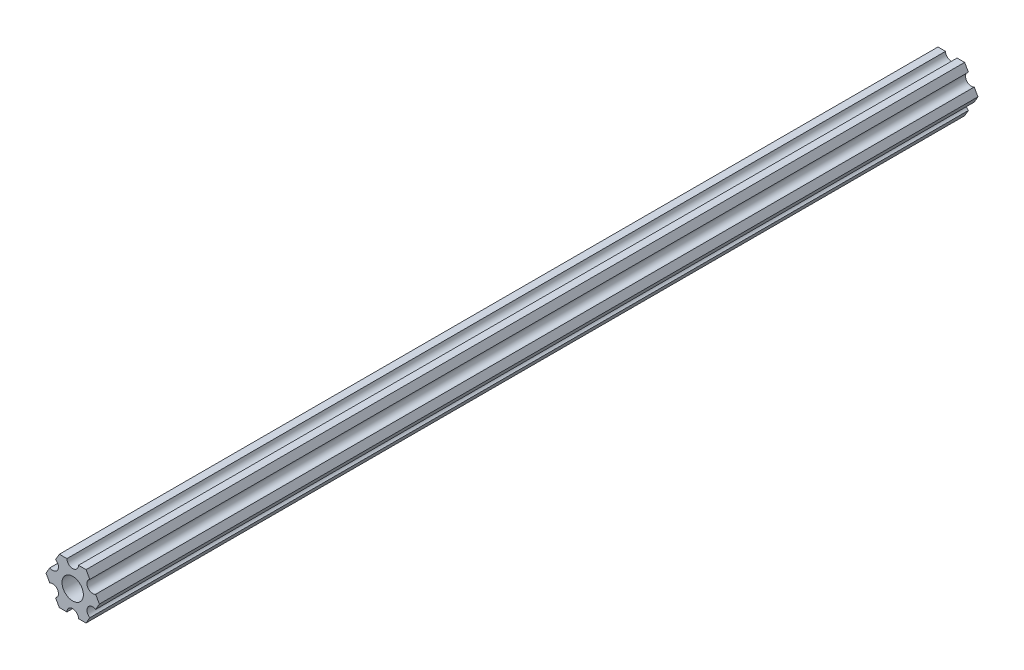
ISO-10303-21;
HEADER;
FILE_DESCRIPTION(('STEP AP214'),'2;1');
FILE_NAME('part.step','',(''),(''),'','','');
FILE_SCHEMA(('AUTOMOTIVE_DESIGN { 1 0 10303 214 1 1 1 1 }'));
ENDSEC;
DATA;
#1=APPLICATION_CONTEXT('core data for automotive mechanical design processes');
#2=APPLICATION_PROTOCOL_DEFINITION('international standard','automotive_design',2000,#1);
#3=PRODUCT_CONTEXT('',#1,'mechanical');
#4=PRODUCT('Part','Part','',(#3));
#5=PRODUCT_RELATED_PRODUCT_CATEGORY('part','',(#4));
#6=PRODUCT_DEFINITION_FORMATION('','',#4);
#7=PRODUCT_DEFINITION_CONTEXT('part definition',#1,'design');
#8=PRODUCT_DEFINITION('design','',#6,#7);
#9=PRODUCT_DEFINITION_SHAPE('','',#8);
#10=(LENGTH_UNIT() NAMED_UNIT(*) SI_UNIT(.MILLI.,.METRE.));
#11=(NAMED_UNIT(*) PLANE_ANGLE_UNIT() SI_UNIT($,.RADIAN.));
#12=(NAMED_UNIT(*) SI_UNIT($,.STERADIAN.) SOLID_ANGLE_UNIT());
#13=UNCERTAINTY_MEASURE_WITH_UNIT(LENGTH_MEASURE(1.E-05),#10,'distance_accuracy_value','');
#14=(GEOMETRIC_REPRESENTATION_CONTEXT(3) GLOBAL_UNCERTAINTY_ASSIGNED_CONTEXT((#13)) GLOBAL_UNIT_ASSIGNED_CONTEXT((#10,
#11,#12)) REPRESENTATION_CONTEXT('',''));
#15=CARTESIAN_POINT('',(0.,0.,0.));
#16=DIRECTION('',(0.,0.,1.));
#17=DIRECTION('',(1.,0.,0.));
#18=AXIS2_PLACEMENT_3D('',#15,#16,#17);
#19=CARTESIAN_POINT('',(6.29301142309098,-1.80018429024546,85.725));
#20=DIRECTION('',(-0.866025434075723,0.499999947533953,0.));
#21=DIRECTION('',(0.,0.,1.));
#22=AXIS2_PLACEMENT_3D('',#19,#20,#21);
#23=PLANE('',#22);
#24=DIRECTION('',(0.,0.,1.));
#25=VECTOR('',#24,1.);
#26=CARTESIAN_POINT('',(7.33234841870827,4.44212519169686E-07,85.725));
#27=LINE('',#26,#25);
#28=CARTESIAN_POINT('',(7.33234841870826,4.44212518961143E-07,-155.575));
#29=VERTEX_POINT('',#28);
#30=CARTESIAN_POINT('',(7.33234841870826,4.44212519315656E-07,85.725));
#31=VERTEX_POINT('',#30);
#32=EDGE_CURVE('E12',#29,#31,#27,.T.);
#33=ORIENTED_EDGE('',*,*,#32,.T.);
#34=DIRECTION('',(0.499999947533953,0.866025434075723,0.));
#35=VECTOR('',#34,1.);
#36=CARTESIAN_POINT('',(6.29301142309098,-1.80018429024546,85.725));
#37=LINE('',#36,#35);
#38=CARTESIAN_POINT('',(6.29301142309098,-1.80018429024546,85.725));
#39=VERTEX_POINT('',#38);
#40=EDGE_CURVE('E303',#39,#31,#37,.T.);
#41=ORIENTED_EDGE('',*,*,#40,.F.);
#42=DIRECTION('',(0.,0.,-1.));
#43=VECTOR('',#42,1.);
#44=CARTESIAN_POINT('',(6.29301142309098,-1.80018429024546,85.725));
#45=LINE('',#44,#43);
#46=CARTESIAN_POINT('',(6.29301142309098,-1.80018429024546,-155.575));
#47=VERTEX_POINT('',#46);
#48=EDGE_CURVE('E302',#39,#47,#45,.T.);
#49=ORIENTED_EDGE('',*,*,#48,.T.);
#50=DIRECTION('',(-0.499999947533953,-0.866025434075723,0.));
#51=VECTOR('',#50,1.);
#52=CARTESIAN_POINT('',(6.29301142309098,-1.80018429024546,-155.575));
#53=LINE('',#52,#51);
#54=EDGE_CURVE('E221',#29,#47,#53,.T.);
#55=ORIENTED_EDGE('',*,*,#54,.F.);
#56=EDGE_LOOP('',(#33,#41,#49,#55));
#57=FACE_BOUND('',#56,.T.);
#58=ADVANCED_FACE('F53',(#57),#23,.F.);
#59=CARTESIAN_POINT('',(7.33234841870827,4.44212519169686E-07,85.725));
#60=DIRECTION('',(-0.866025373493145,-0.500000052466057,0.));
#61=DIRECTION('',(-0.500000052466057,0.866025373493145,0.));
#62=AXIS2_PLACEMENT_3D('',#59,#60,#61);
#63=PLANE('',#62);
#64=DIRECTION('',(0.,0.,1.));
#65=VECTOR('',#64,1.);
#66=CARTESIAN_POINT('',(6.29301120497139,1.80018505273894,85.725));
#67=LINE('',#66,#65);
#68=CARTESIAN_POINT('',(6.29301120497139,1.80018505273894,-155.575));
#69=VERTEX_POINT('',#68);
#70=CARTESIAN_POINT('',(6.29301120497139,1.80018505273894,85.725));
#71=VERTEX_POINT('',#70);
#72=EDGE_CURVE('E61',#69,#71,#67,.T.);
#73=ORIENTED_EDGE('',*,*,#72,.T.);
#74=DIRECTION('',(-0.500000052466057,0.866025373493145,0.));
#75=VECTOR('',#74,1.);
#76=CARTESIAN_POINT('',(7.33234841870827,4.44212519198906E-07,85.725));
#77=LINE('',#76,#75);
#78=EDGE_CURVE('E307',#31,#71,#77,.T.);
#79=ORIENTED_EDGE('',*,*,#78,.F.);
#80=ORIENTED_EDGE('',*,*,#32,.F.);
#81=DIRECTION('',(0.500000052466055,-0.866025373493145,0.));
#82=VECTOR('',#81,1.);
#83=CARTESIAN_POINT('',(7.33234841870826,4.44212518961143E-07,-155.575));
#84=LINE('',#83,#82);
#85=EDGE_CURVE('E215',#69,#29,#84,.T.);
#86=ORIENTED_EDGE('',*,*,#85,.F.);
#87=EDGE_LOOP('',(#73,#79,#80,#86));
#88=FACE_BOUND('',#87,.T.);
#89=ADVANCED_FACE('F216',(#88),#63,.F.);
#90=CARTESIAN_POINT('',(4.70551103839172,4.54981561357972,85.725));
#91=DIRECTION('',(-0.866025373493151,-0.500000052466046,0.));
#92=DIRECTION('',(-0.500000052466046,0.866025373493151,0.));
#93=AXIS2_PLACEMENT_3D('',#90,#91,#92);
#94=PLANE('',#93);
#95=DIRECTION('',(0.,0.,1.));
#96=VECTOR('',#95,1.);
#97=CARTESIAN_POINT('',(3.66617382465481,6.35000022210627,85.725));
#98=LINE('',#97,#96);
#99=CARTESIAN_POINT('',(3.66617382465481,6.35000022210627,-155.575));
#100=VERTEX_POINT('',#99);
#101=CARTESIAN_POINT('',(3.66617382465481,6.35000022210627,85.725));
#102=VERTEX_POINT('',#101);
#103=EDGE_CURVE('E213',#100,#102,#98,.T.);
#104=ORIENTED_EDGE('',*,*,#103,.T.);
#105=DIRECTION('',(-0.500000052466046,0.866025373493151,0.));
#106=VECTOR('',#105,1.);
#107=CARTESIAN_POINT('',(4.70551103839172,4.54981561357972,85.725));
#108=LINE('',#107,#106);
#109=CARTESIAN_POINT('',(4.70551103839172,4.54981561357972,85.725));
#110=VERTEX_POINT('',#109);
#111=EDGE_CURVE('E338',#110,#102,#108,.T.);
#112=ORIENTED_EDGE('',*,*,#111,.F.);
#113=DIRECTION('',(0.,0.,1.));
#114=VECTOR('',#113,1.);
#115=CARTESIAN_POINT('',(4.70551103839172,4.54981561357972,85.725));
#116=LINE('',#115,#114);
#117=CARTESIAN_POINT('',(4.70551103839172,4.54981561357972,-155.575));
#118=VERTEX_POINT('',#117);
#119=EDGE_CURVE('E301',#118,#110,#116,.T.);
#120=ORIENTED_EDGE('',*,*,#119,.F.);
#121=DIRECTION('',(0.500000052466045,-0.866025373493151,0.));
#122=VECTOR('',#121,1.);
#123=CARTESIAN_POINT('',(4.70551103839172,4.54981561357972,-155.575));
#124=LINE('',#123,#122);
#125=EDGE_CURVE('E227',#100,#118,#124,.T.);
#126=ORIENTED_EDGE('',*,*,#125,.F.);
#127=EDGE_LOOP('',(#104,#112,#120,#126));
#128=FACE_BOUND('',#127,.T.);
#129=ADVANCED_FACE('F414',(#128),#94,.F.);
#130=CARTESIAN_POINT('',(3.66617382465481,6.35000022210627,85.725));
#131=DIRECTION('',(6.05825850611185E-08,-1.,0.));
#132=DIRECTION('',(0.,0.,-1.));
#133=AXIS2_PLACEMENT_3D('',#130,#131,#132);
#134=PLANE('',#133);
#135=DIRECTION('',(0.,0.,1.));
#136=VECTOR('',#135,1.);
#137=CARTESIAN_POINT('',(1.58749961530074,6.35000009617482,85.725));
#138=LINE('',#137,#136);
#139=CARTESIAN_POINT('',(1.58749961530073,6.35000015914054,-155.575));
#140=VERTEX_POINT('',#139);
#141=CARTESIAN_POINT('',(1.58749961530073,6.35000015914054,85.725));
#142=VERTEX_POINT('',#141);
#143=EDGE_CURVE('E335',#140,#142,#138,.T.);
#144=ORIENTED_EDGE('',*,*,#143,.T.);
#145=DIRECTION('',(-1.,0.,0.));
#146=VECTOR('',#145,1.);
#147=CARTESIAN_POINT('',(5.49926112168156,6.35000022210627,85.725));
#148=LINE('',#147,#146);
#149=EDGE_CURVE('E342',#102,#142,#148,.T.);
#150=ORIENTED_EDGE('',*,*,#149,.F.);
#151=ORIENTED_EDGE('',*,*,#103,.F.);
#152=DIRECTION('',(1.,3.02912931564594E-08,0.));
#153=VECTOR('',#152,1.);
#154=CARTESIAN_POINT('',(3.66617382465481,6.35000022210627,-155.575));
#155=LINE('',#154,#153);
#156=EDGE_CURVE('E289',#140,#100,#155,.T.);
#157=ORIENTED_EDGE('',*,*,#156,.F.);
#158=EDGE_LOOP('',(#144,#150,#151,#157));
#159=FACE_BOUND('',#158,.T.);
#160=ADVANCED_FACE('F417',(#159),#134,.F.);
#161=CARTESIAN_POINT('',(-3.84699260060323E-07,6.35,85.725));
#162=DIRECTION('',(0.,0.,-1.));
#163=DIRECTION('',(-1.,0.,0.));
#164=AXIS2_PLACEMENT_3D('',#161,#162,#163);
#165=CYLINDRICAL_SURFACE('',#164,1.5875);
#166=DIRECTION('',(0.,0.,1.));
#167=VECTOR('',#166,1.);
#168=CARTESIAN_POINT('',(-1.58750038469926,6.34999990382518,85.725));
#169=LINE('',#168,#167);
#170=CARTESIAN_POINT('',(-1.58750038469926,6.34999990382519,-155.575));
#171=VERTEX_POINT('',#170);
#172=CARTESIAN_POINT('',(-1.58750038469926,6.34999990382519,85.725));
#173=VERTEX_POINT('',#172);
#174=EDGE_CURVE('E332',#171,#173,#169,.T.);
#175=ORIENTED_EDGE('',*,*,#174,.T.);
#176=CARTESIAN_POINT('',(-3.84699260060323E-07,6.35,85.725));
#177=DIRECTION('',(0.,0.,-1.));
#178=DIRECTION('',(-1.,0.,0.));
#179=AXIS2_PLACEMENT_3D('',#176,#177,#178);
#180=CIRCLE('',#179,1.5875);
#181=EDGE_CURVE('E346',#142,#173,#180,.T.);
#182=ORIENTED_EDGE('',*,*,#181,.F.);
#183=ORIENTED_EDGE('',*,*,#143,.F.);
#184=CARTESIAN_POINT('',(-3.84699260060323E-07,6.35,-155.575));
#185=DIRECTION('',(0.,0.,1.));
#186=DIRECTION('',(-1.,0.,0.));
#187=AXIS2_PLACEMENT_3D('',#184,#185,#186);
#188=CIRCLE('',#187,1.5875);
#189=EDGE_CURVE('E285',#171,#140,#188,.T.);
#190=ORIENTED_EDGE('',*,*,#189,.F.);
#191=EDGE_LOOP('',(#175,#182,#183,#190));
#192=FACE_BOUND('',#191,.T.);
#193=ADVANCED_FACE('F466',(#192),#165,.F.);
#194=CARTESIAN_POINT('',(-1.58750038469926,6.34999990382518,85.725));
#195=DIRECTION('',(6.05825963273174E-08,-1.,0.));
#196=DIRECTION('',(0.,0.,-1.));
#197=AXIS2_PLACEMENT_3D('',#194,#195,#196);
#198=PLANE('',#197);
#199=DIRECTION('',(0.,0.,1.));
#200=VECTOR('',#199,1.);
#201=CARTESIAN_POINT('',(-3.66617459405349,6.3499997778937,85.725));
#202=LINE('',#201,#200);
#203=CARTESIAN_POINT('',(-3.66617454558244,6.34999986184803,-155.575));
#204=VERTEX_POINT('',#203);
#205=CARTESIAN_POINT('',(-3.66617454558244,6.34999986184803,85.725));
#206=VERTEX_POINT('',#205);
#207=EDGE_CURVE('E325',#204,#206,#202,.T.);
#208=ORIENTED_EDGE('',*,*,#207,.T.);
#209=DIRECTION('',(-1.,0.,0.));
#210=VECTOR('',#209,1.);
#211=CARTESIAN_POINT('',(5.49926112168156,6.34999990382519,85.725));
#212=LINE('',#211,#210);
#213=EDGE_CURVE('E350',#173,#206,#212,.T.);
#214=ORIENTED_EDGE('',*,*,#213,.F.);
#215=ORIENTED_EDGE('',*,*,#174,.F.);
#216=DIRECTION('',(1.,2.0194198968488E-08,0.));
#217=VECTOR('',#216,1.);
#218=CARTESIAN_POINT('',(-1.58750038469926,6.34999990382519,-155.575));
#219=LINE('',#218,#217);
#220=EDGE_CURVE('E281',#204,#171,#219,.T.);
#221=ORIENTED_EDGE('',*,*,#220,.F.);
#222=EDGE_LOOP('',(#208,#214,#215,#221));
#223=FACE_BOUND('',#222,.T.);
#224=ADVANCED_FACE('F463',(#223),#198,.F.);
#225=CARTESIAN_POINT('',(-3.66617459405349,6.3499997778937,85.725));
#226=DIRECTION('',(0.866025434075729,-0.499999947533942,0.));
#227=DIRECTION('',(0.,0.,-1.));
#228=AXIS2_PLACEMENT_3D('',#225,#226,#227);
#229=PLANE('',#228);
#230=DIRECTION('',(0.,0.,1.));
#231=VECTOR('',#230,1.);
#232=CARTESIAN_POINT('',(-4.70551158967065,4.54981504343587,85.725));
#233=LINE('',#232,#231);
#234=CARTESIAN_POINT('',(-4.70551158967065,4.54981504343587,-155.575));
#235=VERTEX_POINT('',#234);
#236=CARTESIAN_POINT('',(-4.70551158967065,4.54981504343587,85.725));
#237=VERTEX_POINT('',#236);
#238=EDGE_CURVE('E322',#235,#237,#233,.T.);
#239=ORIENTED_EDGE('',*,*,#238,.T.);
#240=DIRECTION('',(-0.499999947533943,-0.866025434075729,0.));
#241=VECTOR('',#240,1.);
#242=CARTESIAN_POINT('',(-3.66617459405349,6.3499997778937,85.725));
#243=LINE('',#242,#241);
#244=EDGE_CURVE('E354',#206,#237,#243,.T.);
#245=ORIENTED_EDGE('',*,*,#244,.F.);
#246=ORIENTED_EDGE('',*,*,#207,.F.);
#247=DIRECTION('',(0.499999947533939,0.866025434075731,0.));
#248=VECTOR('',#247,1.);
#249=CARTESIAN_POINT('',(-3.66617454558244,6.34999986184803,-155.575));
#250=LINE('',#249,#248);
#251=EDGE_CURVE('E277',#235,#204,#250,.T.);
#252=ORIENTED_EDGE('',*,*,#251,.F.);
#253=EDGE_LOOP('',(#239,#245,#246,#252));
#254=FACE_BOUND('',#253,.T.);
#255=ADVANCED_FACE('F459',(#254),#229,.F.);
#256=CARTESIAN_POINT('',(-5.49926150638082,3.17499966684067,85.725));
#257=DIRECTION('',(0.,0.,-1.));
#258=DIRECTION('',(-1.,0.,0.));
#259=AXIS2_PLACEMENT_3D('',#256,#257,#258);
#260=CYLINDRICAL_SURFACE('',#259,1.5875);
#261=DIRECTION('',(0.,0.,1.));
#262=VECTOR('',#261,1.);
#263=CARTESIAN_POINT('',(-6.29301142309098,1.80018429024547,85.725));
#264=LINE('',#263,#262);
#265=CARTESIAN_POINT('',(-6.29301142309098,1.80018429024546,-155.575));
#266=VERTEX_POINT('',#265);
#267=CARTESIAN_POINT('',(-6.29301142309098,1.80018429024547,85.725));
#268=VERTEX_POINT('',#267);
#269=EDGE_CURVE('E326',#266,#268,#264,.T.);
#270=ORIENTED_EDGE('',*,*,#269,.T.);
#271=CARTESIAN_POINT('',(-5.49926150638082,3.17499966684067,85.725));
#272=DIRECTION('',(0.,0.,-1.));
#273=DIRECTION('',(-1.,0.,0.));
#274=AXIS2_PLACEMENT_3D('',#271,#272,#273);
#275=CIRCLE('',#274,1.5875);
#276=EDGE_CURVE('E364',#237,#268,#275,.T.);
#277=ORIENTED_EDGE('',*,*,#276,.F.);
#278=ORIENTED_EDGE('',*,*,#238,.F.);
#279=CARTESIAN_POINT('',(-5.49926150638082,3.17499966684067,-155.575));
#280=DIRECTION('',(0.,0.,1.));
#281=DIRECTION('',(-1.,0.,0.));
#282=AXIS2_PLACEMENT_3D('',#279,#280,#281);
#283=CIRCLE('',#282,1.5875);
#284=EDGE_CURVE('E273',#266,#235,#283,.T.);
#285=ORIENTED_EDGE('',*,*,#284,.F.);
#286=EDGE_LOOP('',(#270,#277,#278,#285));
#287=FACE_BOUND('',#286,.T.);
#288=ADVANCED_FACE('F455',(#287),#260,.F.);
#289=CARTESIAN_POINT('',(-6.29301142309098,1.80018429024547,85.725));
#290=DIRECTION('',(0.866025434075724,-0.499999947533952,0.));
#291=DIRECTION('',(0.,0.,-1.));
#292=AXIS2_PLACEMENT_3D('',#289,#290,#291);
#293=PLANE('',#292);
#294=DIRECTION('',(0.,0.,1.));
#295=VECTOR('',#294,1.);
#296=CARTESIAN_POINT('',(-7.33234841870827,-4.44212523790841E-07,85.725));
#297=LINE('',#296,#295);
#298=CARTESIAN_POINT('',(-7.33234841870826,-4.44212524036367E-07,-155.575));
#299=VERTEX_POINT('',#298);
#300=CARTESIAN_POINT('',(-7.33234841870826,-4.44212524036367E-07,85.725));
#301=VERTEX_POINT('',#300);
#302=EDGE_CURVE('E319',#299,#301,#297,.T.);
#303=ORIENTED_EDGE('',*,*,#302,.T.);
#304=DIRECTION('',(-0.499999947533952,-0.866025434075724,0.));
#305=VECTOR('',#304,1.);
#306=CARTESIAN_POINT('',(-6.29301142309098,1.80018429024547,85.725));
#307=LINE('',#306,#305);
#308=EDGE_CURVE('E360',#268,#301,#307,.T.);
#309=ORIENTED_EDGE('',*,*,#308,.F.);
#310=ORIENTED_EDGE('',*,*,#269,.F.);
#311=DIRECTION('',(0.499999947533951,0.866025434075724,0.));
#312=VECTOR('',#311,1.);
#313=CARTESIAN_POINT('',(-6.29301142309098,1.80018429024547,-155.575));
#314=LINE('',#313,#312);
#315=EDGE_CURVE('E269',#299,#266,#314,.T.);
#316=ORIENTED_EDGE('',*,*,#315,.F.);
#317=EDGE_LOOP('',(#303,#309,#310,#316));
#318=FACE_BOUND('',#317,.T.);
#319=ADVANCED_FACE('F451',(#318),#293,.F.);
#320=CARTESIAN_POINT('',(-7.33234841870827,-4.44212523790841E-07,85.725));
#321=DIRECTION('',(0.866025373493151,0.500000052466045,0.));
#322=DIRECTION('',(0.,0.,-1.));
#323=AXIS2_PLACEMENT_3D('',#320,#321,#322);
#324=PLANE('',#323);
#325=DIRECTION('',(0.,0.,1.));
#326=VECTOR('',#325,1.);
#327=CARTESIAN_POINT('',(-6.29301120497141,-1.80018505273897,85.725));
#328=LINE('',#327,#326);
#329=CARTESIAN_POINT('',(-6.29301120497141,-1.80018505273897,-155.575));
#330=VERTEX_POINT('',#329);
#331=CARTESIAN_POINT('',(-6.29301120497141,-1.80018505273897,85.725));
#332=VERTEX_POINT('',#331);
#333=EDGE_CURVE('E312',#330,#332,#328,.T.);
#334=ORIENTED_EDGE('',*,*,#333,.T.);
#335=DIRECTION('',(0.500000052466045,-0.866025373493151,0.));
#336=VECTOR('',#335,1.);
#337=CARTESIAN_POINT('',(-7.33234841870827,-4.44212523969395E-07,85.725));
#338=LINE('',#337,#336);
#339=EDGE_CURVE('E355',#301,#332,#338,.T.);
#340=ORIENTED_EDGE('',*,*,#339,.F.);
#341=ORIENTED_EDGE('',*,*,#302,.F.);
#342=DIRECTION('',(-0.500000052466045,0.866025373493152,0.));
#343=VECTOR('',#342,1.);
#344=CARTESIAN_POINT('',(-7.33234841870826,-4.44212524036367E-07,-155.575));
#345=LINE('',#344,#343);
#346=EDGE_CURVE('E265',#330,#299,#345,.T.);
#347=ORIENTED_EDGE('',*,*,#346,.F.);
#348=EDGE_LOOP('',(#334,#340,#341,#347));
#349=FACE_BOUND('',#348,.T.);
#350=ADVANCED_FACE('F447',(#349),#324,.F.);
#351=CARTESIAN_POINT('',(-5.49926112168156,-3.17500033315934,85.725));
#352=DIRECTION('',(0.,0.,-1.));
#353=DIRECTION('',(-1.,0.,0.));
#354=AXIS2_PLACEMENT_3D('',#351,#352,#353);
#355=CYLINDRICAL_SURFACE('',#354,1.5875);
#356=DIRECTION('',(0.,0.,1.));
#357=VECTOR('',#356,1.);
#358=CARTESIAN_POINT('',(-4.70551103839172,-4.54981561357972,85.725));
#359=LINE('',#358,#357);
#360=CARTESIAN_POINT('',(-4.70551103839172,-4.54981561357972,-155.575));
#361=VERTEX_POINT('',#360);
#362=CARTESIAN_POINT('',(-4.70551103839172,-4.54981561357972,85.725));
#363=VERTEX_POINT('',#362);
#364=EDGE_CURVE('E309',#361,#363,#359,.T.);
#365=ORIENTED_EDGE('',*,*,#364,.T.);
#366=CARTESIAN_POINT('',(-5.49926112168156,-3.17500033315934,85.725));
#367=DIRECTION('',(0.,0.,-1.));
#368=DIRECTION('',(-1.,0.,0.));
#369=AXIS2_PLACEMENT_3D('',#366,#367,#368);
#370=CIRCLE('',#369,1.5875);
#371=EDGE_CURVE('E359',#332,#363,#370,.T.);
#372=ORIENTED_EDGE('',*,*,#371,.F.);
#373=ORIENTED_EDGE('',*,*,#333,.F.);
#374=CARTESIAN_POINT('',(-5.49926112168156,-3.17500033315934,-155.575));
#375=DIRECTION('',(0.,0.,1.));
#376=DIRECTION('',(-1.,0.,0.));
#377=AXIS2_PLACEMENT_3D('',#374,#375,#376);
#378=CIRCLE('',#377,1.5875);
#379=EDGE_CURVE('E261',#361,#330,#378,.T.);
#380=ORIENTED_EDGE('',*,*,#379,.F.);
#381=EDGE_LOOP('',(#365,#372,#373,#380));
#382=FACE_BOUND('',#381,.T.);
#383=ADVANCED_FACE('F443',(#382),#355,.F.);
#384=CARTESIAN_POINT('',(-4.70551103839172,-4.54981561357972,85.725));
#385=DIRECTION('',(0.866025373493152,0.500000052466045,0.));
#386=DIRECTION('',(0.,0.,-1.));
#387=AXIS2_PLACEMENT_3D('',#384,#385,#386);
#388=PLANE('',#387);
#389=DIRECTION('',(0.,0.,1.));
#390=VECTOR('',#389,1.);
#391=CARTESIAN_POINT('',(-3.66617382465481,-6.35000022210628,85.725));
#392=LINE('',#391,#390);
#393=CARTESIAN_POINT('',(-3.66617382465481,-6.35000022210628,-155.575));
#394=VERTEX_POINT('',#393);
#395=CARTESIAN_POINT('',(-3.66617382465481,-6.35000022210628,85.725));
#396=VERTEX_POINT('',#395);
#397=EDGE_CURVE('E313',#394,#396,#392,.T.);
#398=ORIENTED_EDGE('',*,*,#397,.T.);
#399=DIRECTION('',(0.500000052466045,-0.866025373493151,0.));
#400=VECTOR('',#399,1.);
#401=CARTESIAN_POINT('',(-4.70551103839172,-4.54981561357972,85.725));
#402=LINE('',#401,#400);
#403=EDGE_CURVE('E374',#363,#396,#402,.T.);
#404=ORIENTED_EDGE('',*,*,#403,.F.);
#405=ORIENTED_EDGE('',*,*,#364,.F.);
#406=DIRECTION('',(-0.500000052466043,0.866025373493152,0.));
#407=VECTOR('',#406,1.);
#408=CARTESIAN_POINT('',(-4.70551103839172,-4.54981561357972,-155.575));
#409=LINE('',#408,#407);
#410=EDGE_CURVE('E257',#394,#361,#409,.T.);
#411=ORIENTED_EDGE('',*,*,#410,.F.);
#412=EDGE_LOOP('',(#398,#404,#405,#411));
#413=FACE_BOUND('',#412,.T.);
#414=ADVANCED_FACE('F439',(#413),#388,.F.);
#415=CARTESIAN_POINT('',(-3.66617382465481,-6.35000022210628,85.725));
#416=DIRECTION('',(-6.05825854783851E-08,1.,0.));
#417=DIRECTION('',(0.,0.,1.));
#418=AXIS2_PLACEMENT_3D('',#415,#416,#417);
#419=PLANE('',#418);
#420=DIRECTION('',(0.,0.,1.));
#421=VECTOR('',#420,1.);
#422=CARTESIAN_POINT('',(-1.58749961530074,-6.35,85.725));
#423=LINE('',#422,#421);
#424=CARTESIAN_POINT('',(-1.58749961530073,-6.35000011105314,-155.575));
#425=VERTEX_POINT('',#424);
#426=CARTESIAN_POINT('',(-1.58749961530073,-6.35000011105314,85.725));
#427=VERTEX_POINT('',#426);
#428=EDGE_CURVE('E84',#425,#427,#423,.T.);
#429=ORIENTED_EDGE('',*,*,#428,.T.);
#430=DIRECTION('',(1.,0.,0.));
#431=VECTOR('',#430,1.);
#432=CARTESIAN_POINT('',(5.49926112168156,-6.35000022210628,85.725));
#433=LINE('',#432,#431);
#434=EDGE_CURVE('E378',#396,#427,#433,.T.);
#435=ORIENTED_EDGE('',*,*,#434,.F.);
#436=ORIENTED_EDGE('',*,*,#397,.F.);
#437=DIRECTION('',(-0.999999999999999,-5.34249856349036E-08,0.));
#438=VECTOR('',#437,1.);
#439=CARTESIAN_POINT('',(-3.66617382465481,-6.35000022210628,-155.575));
#440=LINE('',#439,#438);
#441=EDGE_CURVE('E253',#425,#394,#440,.T.);
#442=ORIENTED_EDGE('',*,*,#441,.F.);
#443=EDGE_LOOP('',(#429,#435,#436,#442));
#444=FACE_BOUND('',#443,.T.);
#445=ADVANCED_FACE('F436',(#444),#419,.F.);
#446=CARTESIAN_POINT('',(3.8469926204343E-07,-6.35,85.725));
#447=DIRECTION('',(0.,0.,-1.));
#448=DIRECTION('',(-1.,0.,0.));
#449=AXIS2_PLACEMENT_3D('',#446,#447,#448);
#450=CYLINDRICAL_SURFACE('',#449,1.5875);
#451=DIRECTION('',(0.,0.,1.));
#452=VECTOR('',#451,1.);
#453=CARTESIAN_POINT('',(1.58750038469926,-6.34999990382518,85.725));
#454=LINE('',#453,#452);
#455=CARTESIAN_POINT('',(1.58750038469926,-6.34999990382519,-155.575));
#456=VERTEX_POINT('',#455);
#457=CARTESIAN_POINT('',(1.58750038469926,-6.34999990382519,85.725));
#458=VERTEX_POINT('',#457);
#459=EDGE_CURVE('E73',#456,#458,#454,.T.);
#460=ORIENTED_EDGE('',*,*,#459,.T.);
#461=CARTESIAN_POINT('',(3.8469926204343E-07,-6.35,85.725));
#462=DIRECTION('',(0.,0.,-1.));
#463=DIRECTION('',(-1.,0.,0.));
#464=AXIS2_PLACEMENT_3D('',#461,#462,#463);
#465=CIRCLE('',#464,1.5875);
#466=EDGE_CURVE('E382',#427,#458,#465,.T.);
#467=ORIENTED_EDGE('',*,*,#466,.F.);
#468=ORIENTED_EDGE('',*,*,#428,.F.);
#469=CARTESIAN_POINT('',(3.8469926204343E-07,-6.35,-155.575));
#470=DIRECTION('',(0.,0.,1.));
#471=DIRECTION('',(-1.,0.,0.));
#472=AXIS2_PLACEMENT_3D('',#469,#470,#471);
#473=CIRCLE('',#472,1.5875);
#474=EDGE_CURVE('E249',#456,#425,#473,.T.);
#475=ORIENTED_EDGE('',*,*,#474,.F.);
#476=EDGE_LOOP('',(#460,#467,#468,#475));
#477=FACE_BOUND('',#476,.T.);
#478=ADVANCED_FACE('F434',(#477),#450,.F.);
#479=CARTESIAN_POINT('',(1.58750038469926,-6.34999990382518,85.725));
#480=DIRECTION('',(-6.05825721258438E-08,1.,0.));
#481=DIRECTION('',(0.,0.,1.));
#482=AXIS2_PLACEMENT_3D('',#479,#480,#481);
#483=PLANE('',#482);
#484=DIRECTION('',(0.,0.,1.));
#485=VECTOR('',#484,1.);
#486=CARTESIAN_POINT('',(3.66617459405346,-6.34999977789375,85.725));
#487=LINE('',#486,#485);
#488=CARTESIAN_POINT('',(3.66617454558244,-6.34999986184804,-155.575));
#489=VERTEX_POINT('',#488);
#490=CARTESIAN_POINT('',(3.66617454558244,-6.34999986184804,85.725));
#491=VERTEX_POINT('',#490);
#492=EDGE_CURVE('E383',#489,#491,#487,.T.);
#493=ORIENTED_EDGE('',*,*,#492,.T.);
#494=DIRECTION('',(1.,0.,0.));
#495=VECTOR('',#494,1.);
#496=CARTESIAN_POINT('',(5.49926112168156,-6.34999990382519,85.725));
#497=LINE('',#496,#495);
#498=EDGE_CURVE('E390',#458,#491,#497,.T.);
#499=ORIENTED_EDGE('',*,*,#498,.F.);
#500=ORIENTED_EDGE('',*,*,#459,.F.);
#501=DIRECTION('',(-1.,-2.01941943785532E-08,0.));
#502=VECTOR('',#501,1.);
#503=CARTESIAN_POINT('',(1.58750038469926,-6.34999990382519,-155.575));
#504=LINE('',#503,#502);
#505=EDGE_CURVE('E245',#489,#456,#504,.T.);
#506=ORIENTED_EDGE('',*,*,#505,.F.);
#507=EDGE_LOOP('',(#493,#499,#500,#506));
#508=FACE_BOUND('',#507,.T.);
#509=ADVANCED_FACE('F433',(#508),#483,.F.);
#510=CARTESIAN_POINT('',(3.66617459405346,-6.34999977789375,85.725));
#511=DIRECTION('',(-0.86602543407573,0.499999947533941,0.));
#512=DIRECTION('',(0.,0.,1.));
#513=AXIS2_PLACEMENT_3D('',#510,#511,#512);
#514=PLANE('',#513);
#515=DIRECTION('',(0.,0.,-1.));
#516=VECTOR('',#515,1.);
#517=CARTESIAN_POINT('',(4.70551158967065,-4.54981504343587,85.725));
#518=LINE('',#517,#516);
#519=CARTESIAN_POINT('',(4.70551158967065,-4.54981504343587,85.725));
#520=VERTEX_POINT('',#519);
#521=CARTESIAN_POINT('',(4.70551158967065,-4.54981504343587,-155.575));
#522=VERTEX_POINT('',#521);
#523=EDGE_CURVE('E386',#520,#522,#518,.T.);
#524=ORIENTED_EDGE('',*,*,#523,.F.);
#525=DIRECTION('',(0.49999994753394,0.86602543407573,0.));
#526=VECTOR('',#525,1.);
#527=CARTESIAN_POINT('',(3.66617459405346,-6.34999977789376,85.725));
#528=LINE('',#527,#526);
#529=EDGE_CURVE('E308',#491,#520,#528,.T.);
#530=ORIENTED_EDGE('',*,*,#529,.F.);
#531=ORIENTED_EDGE('',*,*,#492,.F.);
#532=DIRECTION('',(-0.499999947533941,-0.86602543407573,0.));
#533=VECTOR('',#532,1.);
#534=CARTESIAN_POINT('',(3.66617454558244,-6.34999986184804,-155.575));
#535=LINE('',#534,#533);
#536=EDGE_CURVE('E241',#522,#489,#535,.T.);
#537=ORIENTED_EDGE('',*,*,#536,.F.);
#538=EDGE_LOOP('',(#524,#530,#531,#537));
#539=FACE_BOUND('',#538,.T.);
#540=ADVANCED_FACE('F430',(#539),#514,.F.);
#541=CARTESIAN_POINT('',(5.49926112168156,3.17500033315934,85.725));
#542=DIRECTION('',(0.,0.,1.));
#543=DIRECTION('',(1.,0.,0.));
#544=AXIS2_PLACEMENT_3D('',#541,#542,#543);
#545=PLANE('',#544);
#546=CARTESIAN_POINT('',(0.,0.,85.725));
#547=DIRECTION('',(0.,0.,-1.));
#548=DIRECTION('',(-1.,0.,0.));
#549=AXIS2_PLACEMENT_3D('',#546,#547,#548);
#550=CIRCLE('',#549,2.9337);
#551=CARTESIAN_POINT('',(-2.9337,0.,85.725));
#552=VERTEX_POINT('',#551);
#553=EDGE_CURVE('E294',#552,#552,#550,.T.);
#554=ORIENTED_EDGE('',*,*,#553,.T.);
#555=EDGE_LOOP('',(#554));
#556=FACE_BOUND('',#555,.T.);
#557=ORIENTED_EDGE('',*,*,#529,.T.);
#558=CARTESIAN_POINT('',(5.49926150638082,-3.17499966684067,85.725));
#559=DIRECTION('',(0.,0.,-1.));
#560=DIRECTION('',(-1.,0.,0.));
#561=AXIS2_PLACEMENT_3D('',#558,#559,#560);
#562=CIRCLE('',#561,1.5875);
#563=EDGE_CURVE('E298',#520,#39,#562,.T.);
#564=ORIENTED_EDGE('',*,*,#563,.T.);
#565=ORIENTED_EDGE('',*,*,#40,.T.);
#566=ORIENTED_EDGE('',*,*,#78,.T.);
#567=CARTESIAN_POINT('',(5.49926112168156,3.17500033315934,85.725));
#568=DIRECTION('',(0.,0.,-1.));
#569=DIRECTION('',(-1.,0.,0.));
#570=AXIS2_PLACEMENT_3D('',#567,#568,#569);
#571=CIRCLE('',#570,1.5875);
#572=EDGE_CURVE('E208',#71,#110,#571,.T.);
#573=ORIENTED_EDGE('',*,*,#572,.T.);
#574=ORIENTED_EDGE('',*,*,#111,.T.);
#575=ORIENTED_EDGE('',*,*,#149,.T.);
#576=ORIENTED_EDGE('',*,*,#181,.T.);
#577=ORIENTED_EDGE('',*,*,#213,.T.);
#578=ORIENTED_EDGE('',*,*,#244,.T.);
#579=ORIENTED_EDGE('',*,*,#276,.T.);
#580=ORIENTED_EDGE('',*,*,#308,.T.);
#581=ORIENTED_EDGE('',*,*,#339,.T.);
#582=ORIENTED_EDGE('',*,*,#371,.T.);
#583=ORIENTED_EDGE('',*,*,#403,.T.);
#584=ORIENTED_EDGE('',*,*,#434,.T.);
#585=ORIENTED_EDGE('',*,*,#466,.T.);
#586=ORIENTED_EDGE('',*,*,#498,.T.);
#587=EDGE_LOOP('',(#557,#564,#565,#566,#573,#574,#575,#576,#577,#578,#579,#580,#581,#582,#583,
#584,#585,#586));
#588=FACE_BOUND('',#587,.T.);
#589=ADVANCED_FACE('F420',(#556,#588),#545,.T.);
#590=CARTESIAN_POINT('',(5.49926112168156,3.17500033315934,85.725));
#591=DIRECTION('',(0.,0.,-1.));
#592=DIRECTION('',(-1.,0.,0.));
#593=AXIS2_PLACEMENT_3D('',#590,#591,#592);
#594=CYLINDRICAL_SURFACE('',#593,1.5875);
#595=ORIENTED_EDGE('',*,*,#572,.F.);
#596=ORIENTED_EDGE('',*,*,#72,.F.);
#597=CARTESIAN_POINT('',(5.49926112168156,3.17500033315934,-155.575));
#598=DIRECTION('',(0.,0.,1.));
#599=DIRECTION('',(-1.,0.,0.));
#600=AXIS2_PLACEMENT_3D('',#597,#598,#599);
#601=CIRCLE('',#600,1.5875);
#602=EDGE_CURVE('E205',#118,#69,#601,.T.);
#603=ORIENTED_EDGE('',*,*,#602,.F.);
#604=ORIENTED_EDGE('',*,*,#119,.T.);
#605=EDGE_LOOP('',(#595,#596,#603,#604));
#606=FACE_BOUND('',#605,.T.);
#607=ADVANCED_FACE('F202',(#606),#594,.F.);
#608=CARTESIAN_POINT('',(5.49926150638082,-3.17499966684067,85.725));
#609=DIRECTION('',(0.,0.,-1.));
#610=DIRECTION('',(-1.,0.,0.));
#611=AXIS2_PLACEMENT_3D('',#608,#609,#610);
#612=CYLINDRICAL_SURFACE('',#611,1.5875);
#613=ORIENTED_EDGE('',*,*,#563,.F.);
#614=ORIENTED_EDGE('',*,*,#523,.T.);
#615=CARTESIAN_POINT('',(5.49926150638082,-3.17499966684067,-155.575));
#616=DIRECTION('',(0.,0.,1.));
#617=DIRECTION('',(-1.,0.,0.));
#618=AXIS2_PLACEMENT_3D('',#615,#616,#617);
#619=CIRCLE('',#618,1.5875);
#620=EDGE_CURVE('E237',#47,#522,#619,.T.);
#621=ORIENTED_EDGE('',*,*,#620,.F.);
#622=ORIENTED_EDGE('',*,*,#48,.F.);
#623=EDGE_LOOP('',(#613,#614,#621,#622));
#624=FACE_BOUND('',#623,.T.);
#625=ADVANCED_FACE('F425',(#624),#612,.F.);
#626=CARTESIAN_POINT('',(0.,0.,85.725));
#627=DIRECTION('',(0.,0.,-1.));
#628=DIRECTION('',(-1.,0.,0.));
#629=AXIS2_PLACEMENT_3D('',#626,#627,#628);
#630=CYLINDRICAL_SURFACE('',#629,2.9337);
#631=ORIENTED_EDGE('',*,*,#553,.F.);
#632=EDGE_LOOP('',(#631));
#633=FACE_BOUND('',#632,.T.);
#634=CARTESIAN_POINT('',(0.,0.,-155.575));
#635=DIRECTION('',(0.,0.,-1.));
#636=DIRECTION('',(-1.,0.,0.));
#637=AXIS2_PLACEMENT_3D('',#634,#635,#636);
#638=CIRCLE('',#637,2.9337);
#639=CARTESIAN_POINT('',(-2.9337,0.,-155.575));
#640=VERTEX_POINT('',#639);
#641=EDGE_CURVE('E229',#640,#640,#638,.T.);
#642=ORIENTED_EDGE('',*,*,#641,.T.);
#643=EDGE_LOOP('',(#642));
#644=FACE_BOUND('',#643,.T.);
#645=ADVANCED_FACE('F485',(#633,#644),#630,.F.);
#646=CARTESIAN_POINT('',(5.49926112168156,3.17500033315934,-155.575));
#647=DIRECTION('',(0.,0.,-1.));
#648=DIRECTION('',(-1.,0.,0.));
#649=AXIS2_PLACEMENT_3D('',#646,#647,#648);
#650=PLANE('',#649);
#651=ORIENTED_EDGE('',*,*,#602,.T.);
#652=ORIENTED_EDGE('',*,*,#85,.T.);
#653=ORIENTED_EDGE('',*,*,#54,.T.);
#654=ORIENTED_EDGE('',*,*,#620,.T.);
#655=ORIENTED_EDGE('',*,*,#536,.T.);
#656=ORIENTED_EDGE('',*,*,#505,.T.);
#657=ORIENTED_EDGE('',*,*,#474,.T.);
#658=ORIENTED_EDGE('',*,*,#441,.T.);
#659=ORIENTED_EDGE('',*,*,#410,.T.);
#660=ORIENTED_EDGE('',*,*,#379,.T.);
#661=ORIENTED_EDGE('',*,*,#346,.T.);
#662=ORIENTED_EDGE('',*,*,#315,.T.);
#663=ORIENTED_EDGE('',*,*,#284,.T.);
#664=ORIENTED_EDGE('',*,*,#251,.T.);
#665=ORIENTED_EDGE('',*,*,#220,.T.);
#666=ORIENTED_EDGE('',*,*,#189,.T.);
#667=ORIENTED_EDGE('',*,*,#156,.T.);
#668=ORIENTED_EDGE('',*,*,#125,.T.);
#669=EDGE_LOOP('',(#651,#652,#653,#654,#655,#656,#657,#658,#659,#660,#661,#662,#663,#664,#665,
#666,#667,#668));
#670=FACE_BOUND('',#669,.T.);
#671=ORIENTED_EDGE('',*,*,#641,.F.);
#672=EDGE_LOOP('',(#671));
#673=FACE_BOUND('',#672,.T.);
#674=ADVANCED_FACE('F223',(#670,#673),#650,.T.);
#675=CLOSED_SHELL('',(#58,#89,#129,#160,#193,#224,#255,#288,#319,#350,#383,#414,#445,#478,#509,
#540,#589,#607,#625,#645,#674));
#676=MANIFOLD_SOLID_BREP('B2',#675);
#677=ADVANCED_BREP_SHAPE_REPRESENTATION('',(#18,#676),#14);
#678=SHAPE_DEFINITION_REPRESENTATION(#9,#677);
ENDSEC;
END-ISO-10303-21;
